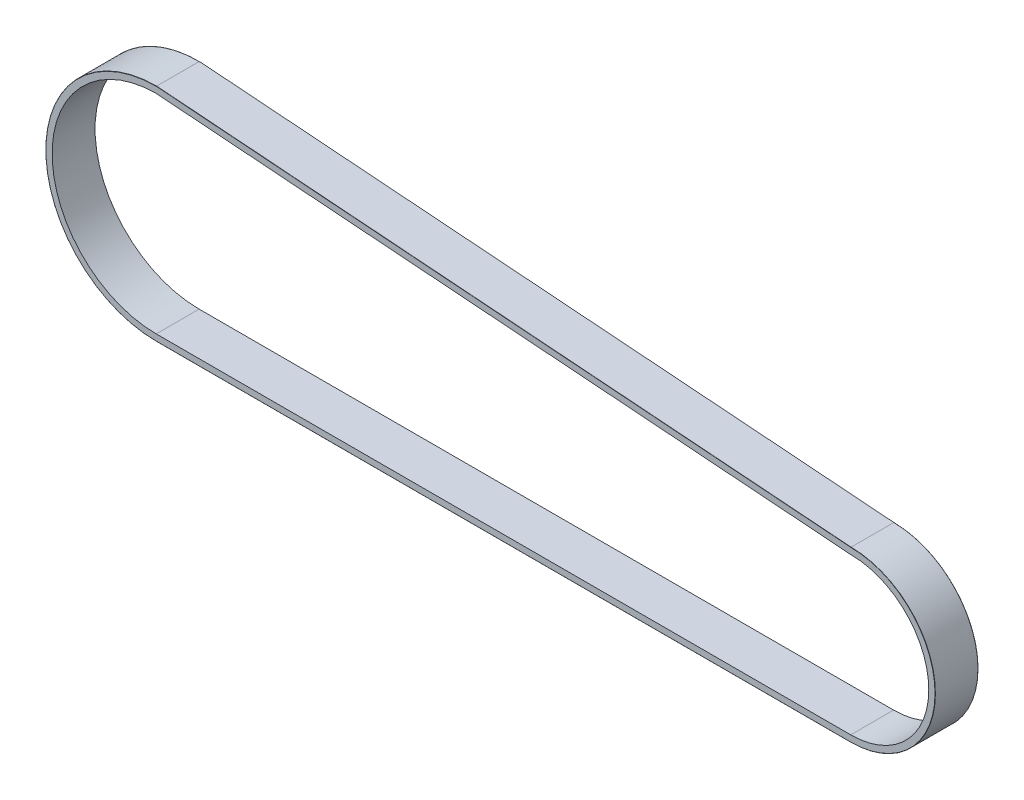
ISO-10303-21;
HEADER;
FILE_DESCRIPTION(('STEP AP214'),'2;1');
FILE_NAME('part.step','',(''),(''),'','','');
FILE_SCHEMA(('AUTOMOTIVE_DESIGN { 1 0 10303 214 1 1 1 1 }'));
ENDSEC;
DATA;
#1=APPLICATION_CONTEXT('core data for automotive mechanical design processes');
#2=APPLICATION_PROTOCOL_DEFINITION('international standard','automotive_design',2000,#1);
#3=PRODUCT_CONTEXT('',#1,'mechanical');
#4=PRODUCT('Part','Part','',(#3));
#5=PRODUCT_RELATED_PRODUCT_CATEGORY('part','',(#4));
#6=PRODUCT_DEFINITION_FORMATION('','',#4);
#7=PRODUCT_DEFINITION_CONTEXT('part definition',#1,'design');
#8=PRODUCT_DEFINITION('design','',#6,#7);
#9=PRODUCT_DEFINITION_SHAPE('','',#8);
#10=(LENGTH_UNIT() NAMED_UNIT(*) SI_UNIT(.MILLI.,.METRE.));
#11=(NAMED_UNIT(*) PLANE_ANGLE_UNIT() SI_UNIT($,.RADIAN.));
#12=(NAMED_UNIT(*) SI_UNIT($,.STERADIAN.) SOLID_ANGLE_UNIT());
#13=UNCERTAINTY_MEASURE_WITH_UNIT(LENGTH_MEASURE(1.E-05),#10,'distance_accuracy_value','');
#14=(GEOMETRIC_REPRESENTATION_CONTEXT(3) GLOBAL_UNCERTAINTY_ASSIGNED_CONTEXT((#13)) GLOBAL_UNIT_ASSIGNED_CONTEXT((#10,
#11,#12)) REPRESENTATION_CONTEXT('',''));
#15=CARTESIAN_POINT('',(0.,0.,0.));
#16=DIRECTION('',(0.,0.,1.));
#17=DIRECTION('',(1.,0.,0.));
#18=AXIS2_PLACEMENT_3D('',#15,#16,#17);
#19=CARTESIAN_POINT('',(0.110098028491105,51.4103821097852,9.90000000000002));
#20=DIRECTION('',(0.0344007400908703,0.893647151165195,0.447449838859656));
#21=DIRECTION('',(0.,0.447714832592684,-0.894176396846006));
#22=AXIS2_PLACEMENT_3D('',#19,#20,#21);
#23=SPHERICAL_SURFACE('',#22,0.0999999999999834);
#24=CARTESIAN_POINT('',(0.113538102500192,51.4997468249017,9.94474498388598));
#25=VERTEX_POINT('',#24);
#26=VERTEX_LOOP('',#25);
#27=FACE_BOUND('',#26,.T.);
#28=CARTESIAN_POINT('',(0.110098028491102,51.4103821097852,9.90000000000003));
#29=DIRECTION('',(0.999997706884493,-0.00214154751443971,0.));
#30=DIRECTION('',(0.00214154751443971,0.999997706884493,0.));
#31=AXIS2_PLACEMENT_3D('',#28,#29,#30);
#32=CIRCLE('',#31,0.1);
#33=CARTESIAN_POINT('',(0.110098028491068,51.4103821097769,10.));
#34=VERTEX_POINT('',#33);
#35=CARTESIAN_POINT('',(0.110312183242501,51.5103818804736,9.90000000000002));
#36=VERTEX_POINT('',#35);
#37=EDGE_CURVE('E239',#34,#36,#32,.F.);
#38=ORIENTED_EDGE('',*,*,#37,.F.);
#39=CARTESIAN_POINT('',(0.110098028490963,51.4103821097852,9.9));
#40=DIRECTION('',(0.997203037320641,-0.0747402325289947,0.));
#41=DIRECTION('',(0.0747402325289947,0.997203037320641,0.));
#42=AXIS2_PLACEMENT_3D('',#39,#40,#41);
#43=CIRCLE('',#42,0.1);
#44=CARTESIAN_POINT('',(0.117572051743888,51.5101024135173,9.90000000000002));
#45=VERTEX_POINT('',#44);
#46=EDGE_CURVE('E244',#45,#34,#43,.T.);
#47=ORIENTED_EDGE('',*,*,#46,.F.);
#48=CARTESIAN_POINT('',(0.110098028491018,51.4103821097852,9.90000000000002));
#49=DIRECTION('',(0.,0.,1.));
#50=DIRECTION('',(1.,0.,0.));
#51=AXIS2_PLACEMENT_3D('',#48,#49,#50);
#52=CIRCLE('',#51,0.1);
#53=EDGE_CURVE('E21',#36,#45,#52,.F.);
#54=ORIENTED_EDGE('',*,*,#53,.F.);
#55=EDGE_LOOP('',(#38,#47,#54));
#56=FACE_BOUND('',#55,.T.);
#57=ADVANCED_FACE('F17',(#27,#56),#23,.T.);
#58=CARTESIAN_POINT('',(0.110098028491018,51.4103821097852,0.));
#59=DIRECTION('',(0.,0.,1.));
#60=DIRECTION('',(1.,0.,0.));
#61=AXIS2_PLACEMENT_3D('',#58,#59,#60);
#62=CYLINDRICAL_SURFACE('',#61,0.1);
#63=DIRECTION('',(0.,0.,1.));
#64=VECTOR('',#63,1.);
#65=CARTESIAN_POINT('',(0.117572051743913,51.5101024135172,0.));
#66=LINE('',#65,#64);
#67=CARTESIAN_POINT('',(0.117572051743914,51.5101024135173,-9.90725341794147));
#68=VERTEX_POINT('',#67);
#69=EDGE_CURVE('E138',#68,#45,#66,.T.);
#70=ORIENTED_EDGE('',*,*,#69,.F.);
#71=CARTESIAN_POINT('',(0.117572051743915,51.5101024135173,-9.90725341794147));
#72=CARTESIAN_POINT('',(0.117270113444992,51.5101250437927,-9.90695119219391));
#73=CARTESIAN_POINT('',(0.116968072359231,51.5101463026517,-9.90664896644635));
#74=CARTESIAN_POINT('',(0.116363809547321,51.5101860759611,-9.90604451495122));
#75=CARTESIAN_POINT('',(0.116061587821173,51.5102045904116,-9.90574228920366));
#76=CARTESIAN_POINT('',(0.115456988661778,51.5102388733285,-9.90513783770854));
#77=CARTESIAN_POINT('',(0.115154611228532,51.5102546417949,-9.90483561196097));
#78=CARTESIAN_POINT('',(0.114549725605074,51.5102834314558,-9.90423116046585));
#79=CARTESIAN_POINT('',(0.114247217414863,51.5102964526502,-9.90392893471829));
#80=CARTESIAN_POINT('',(0.113642095237314,51.5103197466882,-9.90332448322316));
#81=CARTESIAN_POINT('',(0.113339481249976,51.5103300195319,-9.9030222574756));
#82=CARTESIAN_POINT('',(0.112734172447079,51.5103478160252,-9.90241780598048));
#83=CARTESIAN_POINT('',(0.112431477631519,51.5103553396748,-9.90211558023291));
#84=CARTESIAN_POINT('',(0.111826032147491,51.5103676371462,-9.90151112873779));
#85=CARTESIAN_POINT('',(0.111523281479022,51.5103724109679,-9.90120890299023));
#86=CARTESIAN_POINT('',(0.110917749269799,51.5103792084376,-9.90060445149511));
#87=CARTESIAN_POINT('',(0.110614967729045,51.5103812320855,-9.90030222574755));
#88=CARTESIAN_POINT('',(0.110312183242462,51.5103818804737,-9.89999999999998));
#89=B_SPLINE_CURVE_WITH_KNOTS('',3,(#71,#72,#73,#74,#75,#76,#77,#78,#79,#80,#81,#82,#83,#84,#85,
#86,#87,#88),.UNSPECIFIED.,.F.,.F.,(4,2,2,2,2,2,2,2,4),(0.,0.00128342032810531,
0.00256684065621083,0.00385026098431746,0.00513368131242298,0.00641710164052836,
0.00770052196863502,0.00898394229673918,0.0102673626248458),.UNSPECIFIED.);
#90=CARTESIAN_POINT('',(0.110312183242459,51.5103818804737,-9.89999999999998));
#91=VERTEX_POINT('',#90);
#92=EDGE_CURVE('E451',#68,#91,#89,.T.);
#93=ORIENTED_EDGE('',*,*,#92,.T.);
#94=DIRECTION('',(0.,0.,-1.));
#95=VECTOR('',#94,1.);
#96=CARTESIAN_POINT('',(0.110312183242455,51.5103818804737,0.));
#97=LINE('',#96,#95);
#98=EDGE_CURVE('E249',#36,#91,#97,.T.);
#99=ORIENTED_EDGE('',*,*,#98,.F.);
#100=ORIENTED_EDGE('',*,*,#53,.T.);
#101=EDGE_LOOP('',(#70,#93,#99,#100));
#102=FACE_BOUND('',#101,.T.);
#103=ADVANCED_FACE('F456',(#102),#62,.T.);
#104=CARTESIAN_POINT('',(323.623,-12.1280000000001,0.));
#105=DIRECTION('',(0.,0.,-1.));
#106=DIRECTION('',(-1.,0.,0.));
#107=AXIS2_PLACEMENT_3D('',#104,#105,#106);
#108=CYLINDRICAL_SURFACE('',#107,39.383);
#109=CARTESIAN_POINT('',(323.623,-12.1280000000001,9.90000000000002));
#110=DIRECTION('',(0.,0.,-1.));
#111=DIRECTION('',(-1.,0.,0.));
#112=AXIS2_PLACEMENT_3D('',#109,#110,#111);
#113=CIRCLE('',#112,39.383);
#114=CARTESIAN_POINT('',(323.62293915296,-51.5109999999531,9.90000000000002));
#115=VERTEX_POINT('',#114);
#116=CARTESIAN_POINT('',(323.737487636195,27.2548335900447,9.90000000000002));
#117=VERTEX_POINT('',#116);
#118=EDGE_CURVE('E245',#115,#117,#113,.F.);
#119=ORIENTED_EDGE('',*,*,#118,.F.);
#120=DIRECTION('',(0.,0.,1.));
#121=VECTOR('',#120,1.);
#122=CARTESIAN_POINT('',(323.62293915296,-51.5109999999531,0.));
#123=LINE('',#122,#121);
#124=CARTESIAN_POINT('',(323.62293915296,-51.5109999999531,-9.89999999999999));
#125=VERTEX_POINT('',#124);
#126=EDGE_CURVE('E455',#125,#115,#123,.T.);
#127=ORIENTED_EDGE('',*,*,#126,.F.);
#128=CARTESIAN_POINT('',(323.623,-12.1280000000001,-9.89999999999999));
#129=DIRECTION('',(0.,0.,1.));
#130=DIRECTION('',(1.,0.,0.));
#131=AXIS2_PLACEMENT_3D('',#128,#129,#130);
#132=CIRCLE('',#131,39.383);
#133=CARTESIAN_POINT('',(323.737487636194,27.2548335900446,-9.90000000000011));
#134=VERTEX_POINT('',#133);
#135=EDGE_CURVE('E293',#134,#125,#132,.F.);
#136=ORIENTED_EDGE('',*,*,#135,.F.);
#137=DIRECTION('',(0.,0.,1.));
#138=VECTOR('',#137,1.);
#139=CARTESIAN_POINT('',(323.737487636195,27.2548335900446,0.));
#140=LINE('',#139,#138);
#141=EDGE_CURVE('E284',#117,#134,#140,.F.);
#142=ORIENTED_EDGE('',*,*,#141,.F.);
#143=EDGE_LOOP('',(#119,#127,#136,#142));
#144=FACE_BOUND('',#143,.T.);
#145=ADVANCED_FACE('F291',(#144),#108,.T.);
#146=CARTESIAN_POINT('',(323.62293915296,-51.5109999999531,0.));
#147=DIRECTION('',(-1.54500775140686E-06,-0.999999999998807,0.));
#148=DIRECTION('',(0.999999999998807,-1.54500775140686E-06,0.));
#149=AXIS2_PLACEMENT_3D('',#146,#147,#148);
#150=PLANE('',#149);
#151=DIRECTION('',(-0.999999999998807,1.54500775140686E-06,0.));
#152=VECTOR('',#151,1.);
#153=CARTESIAN_POINT('',(239.685304784426,-51.5108703156574,9.90000000000002));
#154=LINE('',#153,#152);
#155=CARTESIAN_POINT('',(-7.95841218144028E-05,-51.5104999999096,9.9));
#156=VERTEX_POINT('',#155);
#157=EDGE_CURVE('E134',#156,#115,#154,.F.);
#158=ORIENTED_EDGE('',*,*,#157,.F.);
#159=DIRECTION('',(0.,0.,-1.));
#160=VECTOR('',#159,1.);
#161=CARTESIAN_POINT('',(-7.95841217519586E-05,-51.5104999999385,0.));
#162=LINE('',#161,#160);
#163=CARTESIAN_POINT('',(-7.95841218152865E-05,-51.5104999999241,-9.9));
#164=VERTEX_POINT('',#163);
#165=EDGE_CURVE('E252',#164,#156,#162,.F.);
#166=ORIENTED_EDGE('',*,*,#165,.F.);
#167=DIRECTION('',(0.999999999998807,-1.54500775140686E-06,0.));
#168=VECTOR('',#167,1.);
#169=CARTESIAN_POINT('',(239.685304784426,-51.5108703156574,-9.9));
#170=LINE('',#169,#168);
#171=EDGE_CURVE('E168',#125,#164,#170,.F.);
#172=ORIENTED_EDGE('',*,*,#171,.F.);
#173=ORIENTED_EDGE('',*,*,#126,.T.);
#174=EDGE_LOOP('',(#158,#166,#172,#173));
#175=FACE_BOUND('',#174,.T.);
#176=ADVANCED_FACE('F461',(#175),#150,.T.);
#177=CARTESIAN_POINT('',(0.,0.,0.));
#178=DIRECTION('',(0.,0.,-1.));
#179=DIRECTION('',(-1.,0.,0.));
#180=AXIS2_PLACEMENT_3D('',#177,#178,#179);
#181=CYLINDRICAL_SURFACE('',#180,51.5105);
#182=CARTESIAN_POINT('',(0.,0.,9.90000000000002));
#183=DIRECTION('',(0.,0.,-1.));
#184=DIRECTION('',(-1.,0.,0.));
#185=AXIS2_PLACEMENT_3D('',#182,#183,#184);
#186=CIRCLE('',#185,51.5105);
#187=EDGE_CURVE('E241',#36,#156,#186,.F.);
#188=ORIENTED_EDGE('',*,*,#187,.F.);
#189=ORIENTED_EDGE('',*,*,#98,.T.);
#190=CARTESIAN_POINT('',(0.,0.,-9.89999999999999));
#191=DIRECTION('',(0.,0.,1.));
#192=DIRECTION('',(1.,0.,0.));
#193=AXIS2_PLACEMENT_3D('',#190,#191,#192);
#194=CIRCLE('',#193,51.5105);
#195=EDGE_CURVE('E209',#164,#91,#194,.F.);
#196=ORIENTED_EDGE('',*,*,#195,.F.);
#197=ORIENTED_EDGE('',*,*,#165,.T.);
#198=EDGE_LOOP('',(#188,#189,#196,#197));
#199=FACE_BOUND('',#198,.T.);
#200=ADVANCED_FACE('F180',(#199),#181,.T.);
#201=CARTESIAN_POINT('',(323.623,-12.1280000000001,9.90000000000002));
#202=DIRECTION('',(0.,0.,-1.));
#203=DIRECTION('',(-1.,0.,0.));
#204=AXIS2_PLACEMENT_3D('',#201,#202,#203);
#205=TOROIDAL_SURFACE('',#204,39.283,0.1);
#206=ORIENTED_EDGE('',*,*,#118,.T.);
#207=CARTESIAN_POINT('',(323.737487636195,27.2548335900447,9.90000000000003));
#208=CARTESIAN_POINT('',(323.737450124131,27.2548337338027,9.90163624782521));
#209=CARTESIAN_POINT('',(323.737412495125,27.2547936499724,9.90327249269706));
#210=CARTESIAN_POINT('',(323.737337004639,27.2546332763498,9.90654104216322));
#211=CARTESIAN_POINT('',(323.737299143158,27.2545129865578,9.90817334675756));
#212=CARTESIAN_POINT('',(323.737223189133,27.2541924502282,9.91143008129796));
#213=CARTESIAN_POINT('',(323.737185096589,27.2539922036911,9.91305451124408));
#214=CARTESIAN_POINT('',(323.737108682551,27.2535122474835,9.91629158363149));
#215=CARTESIAN_POINT('',(323.737070361058,27.2532325378139,9.9179042260729));
#216=CARTESIAN_POINT('',(323.736993491745,27.2525943265141,9.92111383830989));
#217=CARTESIAN_POINT('',(323.736954943926,27.2522358248851,9.92271080810567));
#218=CARTESIAN_POINT('',(323.736877625135,27.2514408943735,9.92588522784979));
#219=CARTESIAN_POINT('',(323.736838854164,27.2510044654921,9.92746267779845));
#220=CARTESIAN_POINT('',(323.736761092775,27.2500547319198,9.93059425762275));
#221=CARTESIAN_POINT('',(323.736722102356,27.2495414272303,9.93214838749884));
#222=CARTESIAN_POINT('',(323.736643906298,27.2484391789531,9.93522958314567));
#223=CARTESIAN_POINT('',(323.736604700658,27.2478502353671,9.93675664891701));
#224=CARTESIAN_POINT('',(323.736526078895,27.2465981283569,9.9397800375182));
#225=CARTESIAN_POINT('',(323.736486662772,27.2459349649347,9.94127636034883));
#226=CARTESIAN_POINT('',(323.736407625277,27.2445360161335,9.94423465829589));
#227=CARTESIAN_POINT('',(323.736368003906,27.2438002307565,9.94569663341327));
#228=CARTESIAN_POINT('',(323.736288561637,27.2422578108745,9.94858271390746));
#229=CARTESIAN_POINT('',(323.736248740739,27.2414511763717,9.95000681928544));
#230=CARTESIAN_POINT('',(323.736168905606,27.2397690017493,9.95281372950604));
#231=CARTESIAN_POINT('',(323.736128891371,27.2388934616322,9.95419653435004));
#232=CARTESIAN_POINT('',(323.73604867621,27.2370755852919,9.95691751220447));
#233=CARTESIAN_POINT('',(323.736008475284,27.2361332490712,9.95825568521652));
#234=CARTESIAN_POINT('',(323.735927893823,27.234184050952,9.9608841756308));
#235=CARTESIAN_POINT('',(323.735887513288,27.2331771890561,9.9621744930349));
#236=CARTESIAN_POINT('',(323.735806580109,27.2311013654623,9.96470416374539));
#237=CARTESIAN_POINT('',(323.735766027466,27.2300324037671,9.9659435170539));
#238=CARTESIAN_POINT('',(323.735684757974,27.2278349560544,9.96836827386229));
#239=CARTESIAN_POINT('',(323.735644041124,27.2267064700397,9.96955367736454));
#240=CARTESIAN_POINT('',(323.735562451502,27.2243926925667,9.9718676788193));
#241=CARTESIAN_POINT('',(323.735521578729,27.2232074011112,9.97299627677444));
#242=CARTESIAN_POINT('',(323.735439685901,27.2207828684844,9.97519394824336));
#243=CARTESIAN_POINT('',(323.735398665846,27.2195436273159,9.97626302176003));
#244=CARTESIAN_POINT('',(323.735316487435,27.2170141809605,9.97833906886007));
#245=CARTESIAN_POINT('',(323.735275329078,27.2157239757762,9.97934604244657));
#246=CARTESIAN_POINT('',(323.735192883359,27.2130957098632,9.98129546379842));
#247=CARTESIAN_POINT('',(323.735151595996,27.211757649137,9.98223791156715));
#248=CARTESIAN_POINT('',(323.735068901853,27.209036895902,9.98405601084399));
#249=CARTESIAN_POINT('',(323.735027495073,27.2076542033955,9.98493166235572));
#250=CARTESIAN_POINT('',(323.734944571952,27.2048475178837,9.98661405959721));
#251=CARTESIAN_POINT('',(323.734903055612,27.2034235248806,9.98742080533082));
#252=CARTESIAN_POINT('',(323.734819923474,27.2005376691552,9.98896344749443));
#253=CARTESIAN_POINT('',(323.734778307676,27.1990758064351,9.98969934392849));
#254=CARTESIAN_POINT('',(323.734694986944,27.1961177332869,9.9910985146549));
#255=CARTESIAN_POINT('',(323.73465328201,27.1946215228609,9.99176178895154));
#256=CARTESIAN_POINT('',(323.734569793521,27.1915983590584,9.99301411751296));
#257=CARTESIAN_POINT('',(323.734528009967,27.1900714056837,9.99360317178223));
#258=CARTESIAN_POINT('',(323.734444374924,27.1869904348045,9.99470564122051));
#259=CARTESIAN_POINT('',(323.734402523435,27.1854364173016,9.99521905639419));
#260=CARTESIAN_POINT('',(323.734318763348,27.1823050621828,9.99616901072261));
#261=CARTESIAN_POINT('',(323.734276854751,27.1807277245684,9.99660554988216));
#262=CARTESIAN_POINT('',(323.734192991392,27.1775535294364,9.9974007007316));
#263=CARTESIAN_POINT('',(323.734151036631,27.1759566719201,9.99775931242644));
#264=CARTESIAN_POINT('',(323.734067091975,27.1727472841703,9.99839774363381));
#265=CARTESIAN_POINT('',(323.734025102082,27.1711347539378,9.99867756315139));
#266=CARTESIAN_POINT('',(323.733941098257,27.1678979058812,9.9991577388261));
#267=CARTESIAN_POINT('',(323.733899084326,27.1662735880578,9.99935809498838));
#268=CARTESIAN_POINT('',(323.73381504356,27.16301707766,9.99967885033569));
#269=CARTESIAN_POINT('',(323.733773016724,27.1613848850862,9.99979924952594));
#270=CARTESIAN_POINT('',(323.733688961282,27.1581165595433,9.99995984170991));
#271=CARTESIAN_POINT('',(323.733646932676,27.1564804265745,10.0000000347089));
#272=CARTESIAN_POINT('',(323.733604908752,27.1548442905316,10.));
#273=B_SPLINE_CURVE_WITH_KNOTS('',3,(#207,#208,#209,#210,#211,#212,#213,#214,#215,#216,#217,
#218,#219,#220,#221,#222,#223,#224,#225,#226,#227,#228,#229,#230,#231,#232,#233,#234,#235,#236,
#237,#238,#239,#240,#241,#242,#243,#244,#245,#246,#247,#248,#249,#250,#251,#252,#253,#254,#255,
#256,#257,#258,#259,#260,#261,#262,#263,#264,#265,#266,#267,#268,#269,#270,#271,#272),
.UNSPECIFIED.,.F.,.F.,(4,2,2,2,2,2,2,2,2,2,2,2,2,2,2,2,2,2,2,2,2,2,2,2,2,2,2,2,2,2,2,2,4),(0.,
0.0049095356630641,0.00981907131036116,0.0147286069261555,0.0196381424947839,0.0245476780007264,
0.029457213428576,0.0343667487631567,0.0392762839894617,0.0441858190927986,0.0490953540587509,
0.0540048888732576,0.0589144235226007,0.0638239579934441,0.0687334922729486,0.0736430263486799,
0.0785525602086999,0.0834620938416145,0.0883716272366524,0.093281160383421,0.0981906932723479,
0.10310022589435,0.108009758240992,0.112919290304585,0.117828822078055,0.122738353555057,
0.127647884729979,0.132557415597923,0.137466946154673,0.142376476396864,0.147286006321778,
0.15219553592763,0.157105065213252),.UNSPECIFIED.);
#274=CARTESIAN_POINT('',(323.733604908752,27.1548442905316,9.99999999999999));
#275=VERTEX_POINT('',#274);
#276=EDGE_CURVE('E156',#275,#117,#273,.F.);
#277=ORIENTED_EDGE('',*,*,#276,.F.);
#278=CARTESIAN_POINT('',(323.623,-12.1280000000001,10.));
#279=DIRECTION('',(0.,0.,-1.));
#280=DIRECTION('',(0.00281559220914981,0.9999960362124,0.));
#281=AXIS2_PLACEMENT_3D('',#278,#279,#280);
#282=CIRCLE('',#281,39.283);
#283=CARTESIAN_POINT('',(323.62293930746,-51.4109999999532,10.));
#284=VERTEX_POINT('',#283);
#285=EDGE_CURVE('E144',#284,#275,#282,.F.);
#286=ORIENTED_EDGE('',*,*,#285,.F.);
#287=CARTESIAN_POINT('',(323.622939307461,-51.4109999999532,9.90000000000003));
#288=DIRECTION('',(-0.999999999998807,1.54500775140686E-06,0.));
#289=DIRECTION('',(-1.54500775140686E-06,-0.999999999998807,0.));
#290=AXIS2_PLACEMENT_3D('',#287,#288,#289);
#291=CIRCLE('',#290,0.1);
#292=EDGE_CURVE('E128',#115,#284,#291,.T.);
#293=ORIENTED_EDGE('',*,*,#292,.F.);
#294=EDGE_LOOP('',(#206,#277,#286,#293));
#295=FACE_BOUND('',#294,.T.);
#296=ADVANCED_FACE('F154',(#295),#205,.T.);
#297=CARTESIAN_POINT('',(79.408256255976,45.4669958953111,9.90000000000001));
#298=DIRECTION('',(0.997203037320641,-0.0747402325289947,0.));
#299=DIRECTION('',(0.0747402325289947,0.997203037320641,0.));
#300=AXIS2_PLACEMENT_3D('',#297,#298,#299);
#301=CYLINDRICAL_SURFACE('',#300,0.1);
#302=DIRECTION('',(-0.997203037359994,0.0747402320039416,0.));
#303=VECTOR('',#302,1.);
#304=CARTESIAN_POINT('',(323.733604908752,27.1548442905316,10.));
#305=LINE('',#304,#303);
#306=EDGE_CURVE('E159',#275,#34,#305,.T.);
#307=ORIENTED_EDGE('',*,*,#306,.F.);
#308=ORIENTED_EDGE('',*,*,#276,.T.);
#309=DIRECTION('',(-0.997203037320641,0.0747402325289947,0.));
#310=VECTOR('',#309,1.);
#311=CARTESIAN_POINT('',(0.11394896014977,51.5103739637413,9.90000000000001));
#312=LINE('',#311,#310);
#313=EDGE_CURVE('E280',#45,#117,#312,.F.);
#314=ORIENTED_EDGE('',*,*,#313,.F.);
#315=ORIENTED_EDGE('',*,*,#46,.T.);
#316=EDGE_LOOP('',(#307,#308,#314,#315));
#317=FACE_BOUND('',#316,.T.);
#318=ADVANCED_FACE('F179',(#317),#301,.T.);
#319=CARTESIAN_POINT('',(0.,0.,9.90000000000002));
#320=DIRECTION('',(0.,0.,-1.));
#321=DIRECTION('',(-1.,0.,0.));
#322=AXIS2_PLACEMENT_3D('',#319,#320,#321);
#323=TOROIDAL_SURFACE('',#322,51.4105,0.1);
#324=CARTESIAN_POINT('',(-7.94296210471224E-05,-51.4104999998807,9.89999999999999));
#325=DIRECTION('',(-0.999999999998807,1.54500775140686E-06,0.));
#326=DIRECTION('',(-1.54500775140686E-06,-0.999999999998807,0.));
#327=AXIS2_PLACEMENT_3D('',#324,#325,#326);
#328=CIRCLE('',#327,0.1);
#329=CARTESIAN_POINT('',(-7.94296210020222E-05,-51.4104999998879,9.99999999999999));
#330=VERTEX_POINT('',#329);
#331=EDGE_CURVE('E262',#330,#156,#328,.F.);
#332=ORIENTED_EDGE('',*,*,#331,.F.);
#333=CARTESIAN_POINT('',(0.,0.,10.));
#334=DIRECTION('',(0.,0.,-1.));
#335=DIRECTION('',(-1.54500775088494E-06,-0.999999999998806,0.));
#336=AXIS2_PLACEMENT_3D('',#333,#334,#335);
#337=CIRCLE('',#336,51.410499999971);
#338=EDGE_CURVE('E148',#34,#330,#337,.F.);
#339=ORIENTED_EDGE('',*,*,#338,.F.);
#340=ORIENTED_EDGE('',*,*,#37,.T.);
#341=ORIENTED_EDGE('',*,*,#187,.T.);
#342=EDGE_LOOP('',(#332,#339,#340,#341));
#343=FACE_BOUND('',#342,.T.);
#344=ADVANCED_FACE('F310',(#343),#323,.T.);
#345=CARTESIAN_POINT('',(239.685304938927,-51.4108703156575,9.90000000000002));
#346=DIRECTION('',(-0.999999999998807,1.54500775140686E-06,0.));
#347=DIRECTION('',(-1.54500775140686E-06,-0.999999999998807,0.));
#348=AXIS2_PLACEMENT_3D('',#345,#346,#347);
#349=CYLINDRICAL_SURFACE('',#348,0.1);
#350=ORIENTED_EDGE('',*,*,#292,.T.);
#351=DIRECTION('',(0.999999999998807,-1.54500775145318E-06,0.));
#352=VECTOR('',#351,1.);
#353=CARTESIAN_POINT('',(-7.94296209916112E-05,-51.4104999998807,9.99999999999998));
#354=LINE('',#353,#352);
#355=EDGE_CURVE('E132',#330,#284,#354,.T.);
#356=ORIENTED_EDGE('',*,*,#355,.F.);
#357=ORIENTED_EDGE('',*,*,#331,.T.);
#358=ORIENTED_EDGE('',*,*,#157,.T.);
#359=EDGE_LOOP('',(#350,#356,#357,#358));
#360=FACE_BOUND('',#359,.T.);
#361=ADVANCED_FACE('F130',(#360),#349,.T.);
#362=CARTESIAN_POINT('',(0.11394896014977,51.5103739637413,0.));
#363=DIRECTION('',(0.0747402325289947,0.997203037320641,0.));
#364=DIRECTION('',(-0.997203037320641,0.0747402325289947,0.));
#365=AXIS2_PLACEMENT_3D('',#362,#363,#364);
#366=PLANE('',#365);
#367=CARTESIAN_POINT('',(326.187878687426,27.0711771127759,-9.99999999999998));
#368=CARTESIAN_POINT('',(326.121398545902,27.0761597903753,-9.99999541799155));
#369=CARTESIAN_POINT('',(326.054918317417,27.0811424744923,-9.99999228339063));
#370=CARTESIAN_POINT('',(325.855476790399,27.0960905899185,-9.99992878555123));
#371=CARTESIAN_POINT('',(325.722515464953,27.1060560232449,-9.99981432765166));
#372=CARTESIAN_POINT('',(325.456594183824,27.1259867872339,-9.99912949611659));
#373=CARTESIAN_POINT('',(325.32363422814,27.1359521178967,-9.99855912314518));
#374=CARTESIAN_POINT('',(325.030254351074,27.1579408999307,-9.99623596665629));
#375=CARTESIAN_POINT('',(324.869835427511,27.1699642765154,-9.99426327635356));
#376=CARTESIAN_POINT('',(324.602006910812,27.1900379875521,-9.9884036009571));
#377=CARTESIAN_POINT('',(324.494581371721,27.1980895171512,-9.98536361598634));
#378=CARTESIAN_POINT('',(324.315212017758,27.2115332259266,-9.97817413949058));
#379=CARTESIAN_POINT('',(324.243242556689,27.216927327282,-9.97472049069622));
#380=CARTESIAN_POINT('',(324.12307290509,27.2259340263867,-9.96730256191034));
#381=CARTESIAN_POINT('',(324.074841295687,27.2295489789762,-9.96387994368449));
#382=CARTESIAN_POINT('',(323.994313444715,27.2355845304952,-9.95688074785436));
#383=CARTESIAN_POINT('',(323.961982562891,27.2380077257072,-9.95372337825614));
#384=CARTESIAN_POINT('',(323.908011754208,27.2420528305051,-9.94744229577951));
#385=CARTESIAN_POINT('',(323.886335608155,27.2436774547148,-9.94464569931451));
#386=CARTESIAN_POINT('',(323.850163545069,27.2463885459418,-9.93917073228743));
#387=CARTESIAN_POINT('',(323.835630005349,27.2474778327745,-9.93675090309965));
#388=CARTESIAN_POINT('',(323.811388807246,27.2492947072878,-9.93205694486226));
#389=CARTESIAN_POINT('',(323.801643247754,27.2500251356513,-9.92998963654321));
#390=CARTESIAN_POINT('',(323.785407360776,27.2512420131803,-9.92599693889491));
#391=CARTESIAN_POINT('',(323.778876703786,27.2517314850368,-9.92423917208844));
#392=CARTESIAN_POINT('',(323.768006912425,27.2525461744265,-9.92084897395489));
#393=CARTESIAN_POINT('',(323.763628894085,27.2528743063078,-9.9193532289574));
#394=CARTESIAN_POINT('',(323.756381955578,27.253417463367,-9.91645924087809));
#395=CARTESIAN_POINT('',(323.753465987666,27.2536360147669,-9.915174544365));
#396=CARTESIAN_POINT('',(323.747722614753,27.2540664797886,-9.91221346941186));
#397=CARTESIAN_POINT('',(323.744898179114,27.2542781708571,-9.91052971876156));
#398=CARTESIAN_POINT('',(323.741402211262,27.2545401931739,-9.90755217455014));
#399=CARTESIAN_POINT('',(323.740442288332,27.2546121392673,-9.90661257140512));
#400=CARTESIAN_POINT('',(323.738790802835,27.2547359178816,-9.90445793365745));
#401=CARTESIAN_POINT('',(323.738102461713,27.2547875089554,-9.9032398485578));
#402=CARTESIAN_POINT('',(323.737576998445,27.2548268923561,-9.90130803478559));
#403=CARTESIAN_POINT('',(323.737483363434,27.2548339102875,-9.90066144725755));
#404=CARTESIAN_POINT('',(323.737487636194,27.2548335900446,-9.90000000000024));
#405=B_SPLINE_CURVE_WITH_KNOTS('',3,(#367,#368,#369,#370,#371,#372,#373,#374,#375,#376,#377,
#378,#379,#380,#381,#382,#383,#384,#385,#386,#387,#388,#389,#390,#391,#392,#393,#394,#395,#396,
#397,#398,#399,#400,#401,#402,#403,#404),.UNSPECIFIED.,.F.,.F.,(4,2,2,2,2,2,2,2,2,2,2,2,2,2,2,2,
2,2,4),(0.,0.200000002085546,0.600002457066276,1.00000432941132,1.48263235687795,
1.80592458442658,2.02267038134809,2.16811945144973,2.2658315069537,2.33156730316002,
2.37587816755963,2.40583220016267,2.42616692051485,2.44006002950319,2.44964575460945,
2.45942467254846,2.46344536263008,2.46751240626135,2.46946439371881),.UNSPECIFIED.);
#406=CARTESIAN_POINT('',(326.187878687426,27.071177112776,-9.99999999999998));
#407=VERTEX_POINT('',#406);
#408=EDGE_CURVE('E217',#407,#134,#405,.T.);
#409=ORIENTED_EDGE('',*,*,#408,.F.);
#410=DIRECTION('',(0.997203037320641,-0.0747402325289947,0.));
#411=VECTOR('',#410,1.);
#412=CARTESIAN_POINT('',(1.93002655333069,51.3742591942058,-9.99999999999999));
#413=LINE('',#412,#411);
#414=CARTESIAN_POINT('',(1.93002655333069,51.3742591942058,-9.99999999999999));
#415=VERTEX_POINT('',#414);
#416=EDGE_CURVE('E358',#415,#407,#413,.T.);
#417=ORIENTED_EDGE('',*,*,#416,.F.);
#418=CARTESIAN_POINT('',(0.117572051743682,51.5101024135173,-9.9072534179417));
#419=CARTESIAN_POINT('',(0.118742535964737,51.5100146858832,-9.90839714784681));
#420=CARTESIAN_POINT('',(0.120010519856697,51.5099196506625,-9.90941830723851));
#421=CARTESIAN_POINT('',(0.122662695530185,51.5097208704553,-9.91127733000837));
#422=CARTESIAN_POINT('',(0.124045992718852,51.5096171925186,-9.91211645034717));
#423=CARTESIAN_POINT('',(0.128254606175696,51.5093017575096,-9.91445904383796));
#424=CARTESIAN_POINT('',(0.131162073590349,51.5090838432189,-9.9158057546471));
#425=CARTESIAN_POINT('',(0.139852931775855,51.5084324645735,-9.91944471404213));
#426=CARTESIAN_POINT('',(0.145758409482509,51.5079898498227,-9.92142832612844));
#427=CARTESIAN_POINT('',(0.157679299227705,51.5070963807539,-9.92501370063701));
#428=CARTESIAN_POINT('',(0.163694815070404,51.5066455186557,-9.92661508010935));
#429=CARTESIAN_POINT('',(0.175891195473228,51.5057314015965,-9.92960168034731));
#430=CARTESIAN_POINT('',(0.182073109027421,51.5052680680135,-9.93098261381112));
#431=CARTESIAN_POINT('',(0.194466785612428,51.5043391636329,-9.93357155547681));
#432=CARTESIAN_POINT('',(0.200678521494964,51.5038735948701,-9.93477969817237));
#433=CARTESIAN_POINT('',(0.231491624074116,51.5015641570067,-9.94046825945573));
#434=CARTESIAN_POINT('',(0.256249624430593,51.4997085482348,-9.94408060900146));
#435=CARTESIAN_POINT('',(0.305879264023883,51.495988813472,-9.95048424936611));
#436=CARTESIAN_POINT('',(0.330750985289331,51.4941246813332,-9.95327480060866));
#437=CARTESIAN_POINT('',(0.38028897569362,51.4904118156646,-9.95829111265944));
#438=CARTESIAN_POINT('',(0.404954667016888,51.4885631254421,-9.96052248483416));
#439=CARTESIAN_POINT('',(0.454304411389963,51.484864368788,-9.96461788077383));
#440=CARTESIAN_POINT('',(0.478988452052755,51.483014303285,-9.96648206144618));
#441=CARTESIAN_POINT('',(0.553128352751424,51.4774575277734,-9.97166506541778));
#442=CARTESIAN_POINT('',(0.602613050247059,51.4737486564011,-9.97456890443284));
#443=CARTESIAN_POINT('',(0.70161989981363,51.4663281064412,-9.97965454453322));
#444=CARTESIAN_POINT('',(0.751142053885962,51.4626164277036,-9.98183630383309));
#445=CARTESIAN_POINT('',(0.899768597198871,51.4514768884208,-9.98760022318911));
#446=CARTESIAN_POINT('',(0.998902892595992,51.4440467864131,-9.99039921730736));
#447=CARTESIAN_POINT('',(1.19757200339289,51.4291565634782,-9.99474168529392));
#448=CARTESIAN_POINT('',(1.29710690761195,51.4216964358939,-9.99628034177877));
#449=CARTESIAN_POINT('',(1.49617384999083,51.406776395535,-9.99849748443259));
#450=CARTESIAN_POINT('',(1.59570588703489,51.399316482844,-9.99917607487315));
#451=CARTESIAN_POINT('',(1.73439704697364,51.3889215991994,-9.99971909380107));
#452=CARTESIAN_POINT('',(1.77355558644249,51.3859866719724,-9.99982769658111));
#453=CARTESIAN_POINT('',(1.85181825714556,51.3801208954081,-9.99996809864516));
#454=CARTESIAN_POINT('',(1.89092238818351,51.3771900460854,-10.0000000047082));
#455=CARTESIAN_POINT('',(1.9300265533307,51.3742591942058,-9.99999999999998));
#456=B_SPLINE_CURVE_WITH_KNOTS('',3,(#418,#419,#420,#421,#422,#423,#424,#425,#426,#427,#428,
#429,#430,#431,#432,#433,#434,#435,#436,#437,#438,#439,#440,#441,#442,#443,#444,#445,#446,#447,
#448,#449,#450,#451,#452,#453,#454,#455),.UNSPECIFIED.,.F.,.F.,(4,2,2,2,2,2,2,2,2,2,2,2,2,2,2,2,
2,2,4),(0.,0.00488706837730241,0.00973923481908807,0.0193560951455679,0.0380580219517944,
0.0567786078644466,0.0758277735741597,0.09486203049856,0.170083958138577,0.245373376223485,
0.319873932200326,0.394342583379324,0.543457911574147,0.692581867295585,0.990920698121899,
1.29039461590223,1.58983222296629,1.70763776973978,1.82527920952033),.UNSPECIFIED.);
#457=EDGE_CURVE('E206',#68,#415,#456,.T.);
#458=ORIENTED_EDGE('',*,*,#457,.F.);
#459=ORIENTED_EDGE('',*,*,#69,.T.);
#460=ORIENTED_EDGE('',*,*,#313,.T.);
#461=ORIENTED_EDGE('',*,*,#141,.T.);
#462=EDGE_LOOP('',(#409,#417,#458,#459,#460,#461));
#463=FACE_BOUND('',#462,.T.);
#464=ADVANCED_FACE('F224',(#463),#366,.T.);
#465=CARTESIAN_POINT('',(323.623,-12.1280000000001,-9.89999999999999));
#466=DIRECTION('',(0.,0.,1.));
#467=DIRECTION('',(1.,0.,0.));
#468=AXIS2_PLACEMENT_3D('',#465,#466,#467);
#469=TOROIDAL_SURFACE('',#468,39.283,0.1);
#470=CARTESIAN_POINT('',(323.62293930746,-51.4109999999532,-9.9));
#471=DIRECTION('',(0.999999999998807,-1.54500775140686E-06,0.));
#472=DIRECTION('',(1.54500775140686E-06,0.999999999998807,0.));
#473=AXIS2_PLACEMENT_3D('',#470,#471,#472);
#474=CIRCLE('',#473,0.1);
#475=CARTESIAN_POINT('',(323.62293930746,-51.4109999999677,-9.99999999999999));
#476=VERTEX_POINT('',#475);
#477=EDGE_CURVE('E422',#476,#125,#474,.F.);
#478=ORIENTED_EDGE('',*,*,#477,.F.);
#479=CARTESIAN_POINT('',(323.623,-12.1280000000001,-9.99999999999999));
#480=DIRECTION('',(0.,0.,1.));
#481=DIRECTION('',(-1.54500774423005E-06,-0.999999999998806,0.));
#482=AXIS2_PLACEMENT_3D('',#479,#480,#481);
#483=CIRCLE('',#482,39.283);
#484=EDGE_CURVE('E363',#407,#476,#483,.F.);
#485=ORIENTED_EDGE('',*,*,#484,.F.);
#486=ORIENTED_EDGE('',*,*,#408,.T.);
#487=ORIENTED_EDGE('',*,*,#135,.T.);
#488=EDGE_LOOP('',(#478,#485,#486,#487));
#489=FACE_BOUND('',#488,.T.);
#490=ADVANCED_FACE('F229',(#489),#469,.T.);
#491=CARTESIAN_POINT('',(239.685304938927,-51.4108703156575,-9.9));
#492=DIRECTION('',(0.999999999998807,-1.54500775140686E-06,0.));
#493=DIRECTION('',(1.54500775140686E-06,0.999999999998807,0.));
#494=AXIS2_PLACEMENT_3D('',#491,#492,#493);
#495=CYLINDRICAL_SURFACE('',#494,0.1);
#496=CARTESIAN_POINT('',(-7.94296210414197E-05,-51.4104999999386,-9.9));
#497=DIRECTION('',(0.999999999998807,-1.54500775214051E-06,0.));
#498=DIRECTION('',(-1.54500775214051E-06,-0.999999999998807,0.));
#499=AXIS2_PLACEMENT_3D('',#496,#497,#498);
#500=CIRCLE('',#499,0.1);
#501=CARTESIAN_POINT('',(-7.94296210162048E-05,-51.4104999999386,-10.));
#502=VERTEX_POINT('',#501);
#503=EDGE_CURVE('E413',#502,#164,#500,.F.);
#504=ORIENTED_EDGE('',*,*,#503,.F.);
#505=DIRECTION('',(-0.999999999998807,1.54500757252564E-06,0.));
#506=VECTOR('',#505,1.);
#507=CARTESIAN_POINT('',(323.62293930746,-51.4109999999532,-9.99999999999999));
#508=LINE('',#507,#506);
#509=EDGE_CURVE('E116',#476,#502,#508,.T.);
#510=ORIENTED_EDGE('',*,*,#509,.F.);
#511=ORIENTED_EDGE('',*,*,#477,.T.);
#512=ORIENTED_EDGE('',*,*,#171,.T.);
#513=EDGE_LOOP('',(#504,#510,#511,#512));
#514=FACE_BOUND('',#513,.T.);
#515=ADVANCED_FACE('F433',(#514),#495,.T.);
#516=CARTESIAN_POINT('',(0.,0.,-9.89999999999999));
#517=DIRECTION('',(0.,0.,1.));
#518=DIRECTION('',(1.,0.,0.));
#519=AXIS2_PLACEMENT_3D('',#516,#517,#518);
#520=TOROIDAL_SURFACE('',#519,51.4105,0.1);
#521=ORIENTED_EDGE('',*,*,#92,.F.);
#522=ORIENTED_EDGE('',*,*,#457,.T.);
#523=CARTESIAN_POINT('',(0.,0.,-9.99999999999999));
#524=DIRECTION('',(0.,0.,1.));
#525=DIRECTION('',(0.0375414857535074,0.999295069960529,0.));
#526=AXIS2_PLACEMENT_3D('',#523,#524,#525);
#527=CIRCLE('',#526,51.4105);
#528=EDGE_CURVE('E356',#502,#415,#527,.F.);
#529=ORIENTED_EDGE('',*,*,#528,.F.);
#530=ORIENTED_EDGE('',*,*,#503,.T.);
#531=ORIENTED_EDGE('',*,*,#195,.T.);
#532=EDGE_LOOP('',(#521,#522,#529,#530,#531));
#533=FACE_BOUND('',#532,.T.);
#534=ADVANCED_FACE('F219',(#533),#520,.T.);
#535=CARTESIAN_POINT('',(323.622943787983,-48.5109999999567,0.));
#536=DIRECTION('',(-1.54500775134034E-06,-0.999999999998807,0.));
#537=DIRECTION('',(0.999999999998807,-1.54500775134034E-06,0.));
#538=AXIS2_PLACEMENT_3D('',#535,#536,#537);
#539=PLANE('',#538);
#540=DIRECTION('',(0.,0.,-1.));
#541=VECTOR('',#540,1.);
#542=CARTESIAN_POINT('',(0.,-48.5105,0.));
#543=LINE('',#542,#541);
#544=CARTESIAN_POINT('',(0.,-48.5105,-10.));
#545=VERTEX_POINT('',#544);
#546=CARTESIAN_POINT('',(0.,-48.5105,9.99999999999998));
#547=VERTEX_POINT('',#546);
#548=EDGE_CURVE('E107',#545,#547,#543,.F.);
#549=ORIENTED_EDGE('',*,*,#548,.T.);
#550=DIRECTION('',(-0.999999999998807,1.54500775145527E-06,0.));
#551=VECTOR('',#550,1.);
#552=CARTESIAN_POINT('',(323.622943787983,-48.5109999999567,10.));
#553=LINE('',#552,#551);
#554=CARTESIAN_POINT('',(323.622943787983,-48.5109999999567,10.));
#555=VERTEX_POINT('',#554);
#556=EDGE_CURVE('E151',#555,#547,#553,.T.);
#557=ORIENTED_EDGE('',*,*,#556,.F.);
#558=DIRECTION('',(0.,0.,-1.));
#559=VECTOR('',#558,1.);
#560=CARTESIAN_POINT('',(323.622943787983,-48.5109999999567,0.));
#561=LINE('',#560,#559);
#562=CARTESIAN_POINT('',(323.622943787983,-48.5109999999567,-9.99999999999999));
#563=VERTEX_POINT('',#562);
#564=EDGE_CURVE('E203',#555,#563,#561,.T.);
#565=ORIENTED_EDGE('',*,*,#564,.T.);
#566=DIRECTION('',(0.999999999998807,-1.54500775145527E-06,0.));
#567=VECTOR('',#566,1.);
#568=CARTESIAN_POINT('',(0.,-48.5105,-10.));
#569=LINE('',#568,#567);
#570=EDGE_CURVE('E199',#545,#563,#569,.T.);
#571=ORIENTED_EDGE('',*,*,#570,.F.);
#572=EDGE_LOOP('',(#549,#557,#565,#571));
#573=FACE_BOUND('',#572,.T.);
#574=ADVANCED_FACE('F437',(#573),#539,.F.);
#575=CARTESIAN_POINT('',(0.,0.,0.));
#576=DIRECTION('',(0.,0.,-1.));
#577=DIRECTION('',(-1.,0.,0.));
#578=AXIS2_PLACEMENT_3D('',#575,#576,#577);
#579=CYLINDRICAL_SURFACE('',#578,48.5105);
#580=DIRECTION('',(0.,0.,1.));
#581=VECTOR('',#580,1.);
#582=CARTESIAN_POINT('',(0.,48.5105,0.));
#583=LINE('',#582,#581);
#584=CARTESIAN_POINT('',(0.,48.5105,-9.99999999999999));
#585=VERTEX_POINT('',#584);
#586=CARTESIAN_POINT('',(0.,48.5105,10.));
#587=VERTEX_POINT('',#586);
#588=EDGE_CURVE('E197',#585,#587,#583,.T.);
#589=ORIENTED_EDGE('',*,*,#588,.T.);
#590=CARTESIAN_POINT('',(0.,0.,9.99999999999999));
#591=DIRECTION('',(0.,0.,-1.));
#592=DIRECTION('',(-1.,0.,0.));
#593=AXIS2_PLACEMENT_3D('',#590,#591,#592);
#594=CIRCLE('',#593,48.5105);
#595=EDGE_CURVE('E204',#547,#587,#594,.T.);
#596=ORIENTED_EDGE('',*,*,#595,.F.);
#597=ORIENTED_EDGE('',*,*,#548,.F.);
#598=CARTESIAN_POINT('',(0.,0.,-9.99999999999999));
#599=DIRECTION('',(0.,0.,-1.));
#600=DIRECTION('',(-1.,0.,0.));
#601=AXIS2_PLACEMENT_3D('',#598,#599,#600);
#602=CIRCLE('',#601,48.5105);
#603=EDGE_CURVE('E190',#585,#545,#602,.F.);
#604=ORIENTED_EDGE('',*,*,#603,.F.);
#605=EDGE_LOOP('',(#589,#596,#597,#604));
#606=FACE_BOUND('',#605,.T.);
#607=ADVANCED_FACE('F391',(#606),#579,.F.);
#608=CARTESIAN_POINT('',(155.74775,-0.000250000000039385,10.));
#609=DIRECTION('',(0.,0.,1.));
#610=DIRECTION('',(0.,-1.,0.));
#611=AXIS2_PLACEMENT_3D('',#608,#609,#610);
#612=PLANE('',#611);
#613=DIRECTION('',(-0.997203037320641,0.0747402325289949,0.));
#614=VECTOR('',#613,1.);
#615=CARTESIAN_POINT('',(0.,48.5105,10.));
#616=LINE('',#615,#614);
#617=CARTESIAN_POINT('',(323.623,24.2549999999999,10.));
#618=VERTEX_POINT('',#617);
#619=EDGE_CURVE('E374',#587,#618,#616,.F.);
#620=ORIENTED_EDGE('',*,*,#619,.T.);
#621=CARTESIAN_POINT('',(323.623,-12.1280000000001,10.));
#622=DIRECTION('',(0.,0.,-1.));
#623=DIRECTION('',(-1.,0.,0.));
#624=AXIS2_PLACEMENT_3D('',#621,#622,#623);
#625=CIRCLE('',#624,36.383);
#626=EDGE_CURVE('E200',#618,#555,#625,.T.);
#627=ORIENTED_EDGE('',*,*,#626,.T.);
#628=ORIENTED_EDGE('',*,*,#556,.T.);
#629=ORIENTED_EDGE('',*,*,#595,.T.);
#630=EDGE_LOOP('',(#620,#627,#628,#629));
#631=FACE_BOUND('',#630,.T.);
#632=ORIENTED_EDGE('',*,*,#338,.T.);
#633=ORIENTED_EDGE('',*,*,#355,.T.);
#634=ORIENTED_EDGE('',*,*,#285,.T.);
#635=ORIENTED_EDGE('',*,*,#306,.T.);
#636=EDGE_LOOP('',(#632,#633,#634,#635));
#637=FACE_BOUND('',#636,.T.);
#638=ADVANCED_FACE('F142',(#631,#637),#612,.T.);
#639=CARTESIAN_POINT('',(323.623,-12.1280000000001,0.));
#640=DIRECTION('',(0.,0.,-1.));
#641=DIRECTION('',(-1.,0.,0.));
#642=AXIS2_PLACEMENT_3D('',#639,#640,#641);
#643=CYLINDRICAL_SURFACE('',#642,36.383);
#644=ORIENTED_EDGE('',*,*,#564,.F.);
#645=ORIENTED_EDGE('',*,*,#626,.F.);
#646=DIRECTION('',(0.,0.,1.));
#647=VECTOR('',#646,1.);
#648=CARTESIAN_POINT('',(323.623,24.2549999999999,0.));
#649=LINE('',#648,#647);
#650=CARTESIAN_POINT('',(323.623,24.2549999999999,-9.99999999999999));
#651=VERTEX_POINT('',#650);
#652=EDGE_CURVE('E27',#618,#651,#649,.F.);
#653=ORIENTED_EDGE('',*,*,#652,.T.);
#654=CARTESIAN_POINT('',(323.623,-12.1280000000001,-9.99999999999999));
#655=DIRECTION('',(0.,0.,-1.));
#656=DIRECTION('',(-1.,0.,0.));
#657=AXIS2_PLACEMENT_3D('',#654,#655,#656);
#658=CIRCLE('',#657,36.383);
#659=EDGE_CURVE('E35',#563,#651,#658,.F.);
#660=ORIENTED_EDGE('',*,*,#659,.F.);
#661=EDGE_LOOP('',(#644,#645,#653,#660));
#662=FACE_BOUND('',#661,.T.);
#663=ADVANCED_FACE('F334',(#662),#643,.F.);
#664=CARTESIAN_POINT('',(155.74775,-0.000250000000039385,-9.99999999999999));
#665=DIRECTION('',(0.,0.,-1.));
#666=DIRECTION('',(0.,1.,0.));
#667=AXIS2_PLACEMENT_3D('',#664,#665,#666);
#668=PLANE('',#667);
#669=DIRECTION('',(-0.997203037320641,0.0747402325289949,0.));
#670=VECTOR('',#669,1.);
#671=CARTESIAN_POINT('',(0.,48.5105,-9.99999999999998));
#672=LINE('',#671,#670);
#673=EDGE_CURVE('E11',#651,#585,#672,.T.);
#674=ORIENTED_EDGE('',*,*,#673,.T.);
#675=ORIENTED_EDGE('',*,*,#603,.T.);
#676=ORIENTED_EDGE('',*,*,#570,.T.);
#677=ORIENTED_EDGE('',*,*,#659,.T.);
#678=EDGE_LOOP('',(#674,#675,#676,#677));
#679=FACE_BOUND('',#678,.T.);
#680=ORIENTED_EDGE('',*,*,#509,.T.);
#681=ORIENTED_EDGE('',*,*,#528,.T.);
#682=ORIENTED_EDGE('',*,*,#416,.T.);
#683=ORIENTED_EDGE('',*,*,#484,.T.);
#684=EDGE_LOOP('',(#680,#681,#682,#683));
#685=FACE_BOUND('',#684,.T.);
#686=ADVANCED_FACE('F328',(#679,#685),#668,.T.);
#687=CARTESIAN_POINT('',(0.,48.5105,0.));
#688=DIRECTION('',(0.0747402325289949,0.997203037320641,0.));
#689=DIRECTION('',(-0.997203037320641,0.0747402325289949,0.));
#690=AXIS2_PLACEMENT_3D('',#687,#688,#689);
#691=PLANE('',#690);
#692=ORIENTED_EDGE('',*,*,#652,.F.);
#693=ORIENTED_EDGE('',*,*,#619,.F.);
#694=ORIENTED_EDGE('',*,*,#588,.F.);
#695=ORIENTED_EDGE('',*,*,#673,.F.);
#696=EDGE_LOOP('',(#692,#693,#694,#695));
#697=FACE_BOUND('',#696,.T.);
#698=ADVANCED_FACE('F326',(#697),#691,.F.);
#699=CLOSED_SHELL('',(#57,#103,#145,#176,#200,#296,#318,#344,#361,#464,#490,#515,#534,#574,#607,
#638,#663,#686,#698));
#700=MANIFOLD_SOLID_BREP('B1',#699);
#701=ADVANCED_BREP_SHAPE_REPRESENTATION('',(#18,#700),#14);
#702=SHAPE_DEFINITION_REPRESENTATION(#9,#701);
ENDSEC;
END-ISO-10303-21;
